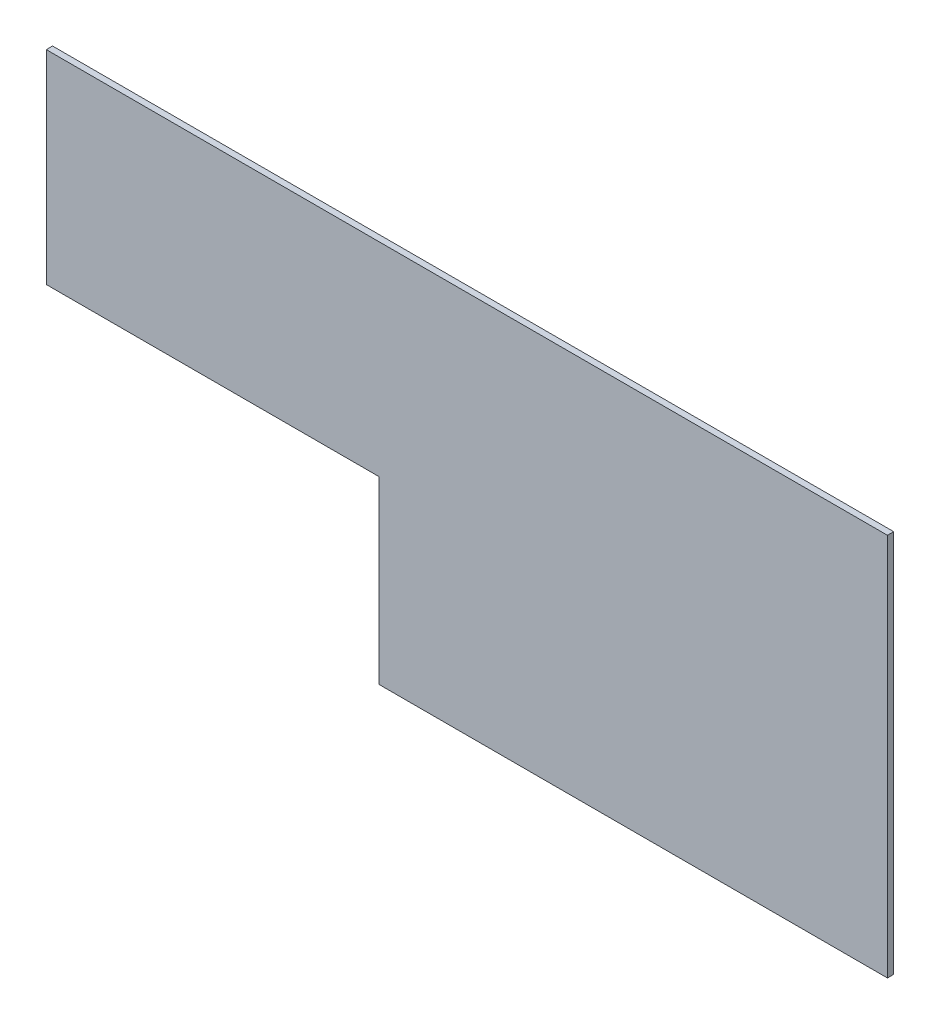
ISO-10303-21;
HEADER;
FILE_DESCRIPTION(('STEP AP214'),'2;1');
FILE_NAME('part.step','',(''),(''),'','','');
FILE_SCHEMA(('AUTOMOTIVE_DESIGN { 1 0 10303 214 1 1 1 1 }'));
ENDSEC;
DATA;
#1=APPLICATION_CONTEXT('core data for automotive mechanical design processes');
#2=APPLICATION_PROTOCOL_DEFINITION('international standard','automotive_design',2000,#1);
#3=PRODUCT_CONTEXT('',#1,'mechanical');
#4=PRODUCT('Part','Part','',(#3));
#5=PRODUCT_RELATED_PRODUCT_CATEGORY('part','',(#4));
#6=PRODUCT_DEFINITION_FORMATION('','',#4);
#7=PRODUCT_DEFINITION_CONTEXT('part definition',#1,'design');
#8=PRODUCT_DEFINITION('design','',#6,#7);
#9=PRODUCT_DEFINITION_SHAPE('','',#8);
#10=(LENGTH_UNIT() NAMED_UNIT(*) SI_UNIT(.MILLI.,.METRE.));
#11=(NAMED_UNIT(*) PLANE_ANGLE_UNIT() SI_UNIT($,.RADIAN.));
#12=(NAMED_UNIT(*) SI_UNIT($,.STERADIAN.) SOLID_ANGLE_UNIT());
#13=UNCERTAINTY_MEASURE_WITH_UNIT(LENGTH_MEASURE(1.E-05),#10,'distance_accuracy_value','');
#14=(GEOMETRIC_REPRESENTATION_CONTEXT(3) GLOBAL_UNCERTAINTY_ASSIGNED_CONTEXT((#13)) GLOBAL_UNIT_ASSIGNED_CONTEXT((#10,
#11,#12)) REPRESENTATION_CONTEXT('',''));
#15=CARTESIAN_POINT('',(0.,0.,0.));
#16=DIRECTION('',(0.,0.,1.));
#17=DIRECTION('',(1.,0.,0.));
#18=AXIS2_PLACEMENT_3D('',#15,#16,#17);
#19=CARTESIAN_POINT('',(4.39438672274884,99.7694438554211,1.6));
#20=DIRECTION('',(1.,0.,0.));
#21=DIRECTION('',(0.,1.,0.));
#22=AXIS2_PLACEMENT_3D('',#19,#20,#21);
#23=PLANE('',#22);
#24=DIRECTION('',(0.,-1.,0.));
#25=VECTOR('',#24,1.);
#26=CARTESIAN_POINT('',(4.39438672274884,99.7694438554211,0.));
#27=LINE('',#26,#25);
#28=CARTESIAN_POINT('',(4.39438672274884,99.7694438554211,0.));
#29=VERTEX_POINT('',#28);
#30=CARTESIAN_POINT('',(4.39438672274881,47.7694438554211,0.));
#31=VERTEX_POINT('',#30);
#32=EDGE_CURVE('E117',#29,#31,#27,.T.);
#33=ORIENTED_EDGE('',*,*,#32,.T.);
#34=DIRECTION('',(0.,0.,-1.));
#35=VECTOR('',#34,1.);
#36=CARTESIAN_POINT('',(4.39438672274881,47.7694438554211,1.6));
#37=LINE('',#36,#35);
#38=CARTESIAN_POINT('',(4.39438672274881,47.7694438554211,1.6));
#39=VERTEX_POINT('',#38);
#40=EDGE_CURVE('E11',#39,#31,#37,.T.);
#41=ORIENTED_EDGE('',*,*,#40,.F.);
#42=DIRECTION('',(0.,-1.,0.));
#43=VECTOR('',#42,1.);
#44=CARTESIAN_POINT('',(4.39438672274884,99.7694438554211,1.6));
#45=LINE('',#44,#43);
#46=CARTESIAN_POINT('',(4.39438672274884,99.7694438554211,1.6));
#47=VERTEX_POINT('',#46);
#48=EDGE_CURVE('E127',#47,#39,#45,.T.);
#49=ORIENTED_EDGE('',*,*,#48,.F.);
#50=DIRECTION('',(0.,0.,-1.));
#51=VECTOR('',#50,1.);
#52=CARTESIAN_POINT('',(4.39438672274884,99.7694438554211,1.6));
#53=LINE('',#52,#51);
#54=EDGE_CURVE('E113',#47,#29,#53,.T.);
#55=ORIENTED_EDGE('',*,*,#54,.T.);
#56=EDGE_LOOP('',(#33,#41,#49,#55));
#57=FACE_BOUND('',#56,.T.);
#58=ADVANCED_FACE('F33',(#57),#23,.F.);
#59=CARTESIAN_POINT('',(4.39438672274881,47.7694438554211,1.6));
#60=DIRECTION('',(0.,1.,0.));
#61=DIRECTION('',(0.,0.,1.));
#62=AXIS2_PLACEMENT_3D('',#59,#60,#61);
#63=PLANE('',#62);
#64=DIRECTION('',(1.,0.,0.));
#65=VECTOR('',#64,1.);
#66=CARTESIAN_POINT('',(4.39438672274881,47.7694438554211,0.));
#67=LINE('',#66,#65);
#68=CARTESIAN_POINT('',(89.3943867227489,47.7694438554211,0.));
#69=VERTEX_POINT('',#68);
#70=EDGE_CURVE('E120',#31,#69,#67,.T.);
#71=ORIENTED_EDGE('',*,*,#70,.T.);
#72=DIRECTION('',(0.,0.,-1.));
#73=VECTOR('',#72,1.);
#74=CARTESIAN_POINT('',(89.3943867227489,47.7694438554211,1.6));
#75=LINE('',#74,#73);
#76=CARTESIAN_POINT('',(89.3943867227489,47.7694438554211,1.6));
#77=VERTEX_POINT('',#76);
#78=EDGE_CURVE('E41',#77,#69,#75,.T.);
#79=ORIENTED_EDGE('',*,*,#78,.F.);
#80=DIRECTION('',(1.,0.,0.));
#81=VECTOR('',#80,1.);
#82=CARTESIAN_POINT('',(4.39438672274881,47.7694438554211,1.6));
#83=LINE('',#82,#81);
#84=EDGE_CURVE('E86',#39,#77,#83,.T.);
#85=ORIENTED_EDGE('',*,*,#84,.F.);
#86=ORIENTED_EDGE('',*,*,#40,.T.);
#87=EDGE_LOOP('',(#71,#79,#85,#86));
#88=FACE_BOUND('',#87,.T.);
#89=ADVANCED_FACE('F151',(#88),#63,.F.);
#90=CARTESIAN_POINT('',(89.3943867227489,47.7694438554211,1.6));
#91=DIRECTION('',(1.,0.,0.));
#92=DIRECTION('',(0.,1.,0.));
#93=AXIS2_PLACEMENT_3D('',#90,#91,#92);
#94=PLANE('',#93);
#95=DIRECTION('',(0.,-1.,0.));
#96=VECTOR('',#95,1.);
#97=CARTESIAN_POINT('',(89.3943867227489,47.7694438554211,0.));
#98=LINE('',#97,#96);
#99=CARTESIAN_POINT('',(89.3943867227489,1.76944385542113,0.));
#100=VERTEX_POINT('',#99);
#101=EDGE_CURVE('E122',#69,#100,#98,.T.);
#102=ORIENTED_EDGE('',*,*,#101,.T.);
#103=DIRECTION('',(0.,0.,-1.));
#104=VECTOR('',#103,1.);
#105=CARTESIAN_POINT('',(89.3943867227489,1.76944385542113,1.6));
#106=LINE('',#105,#104);
#107=CARTESIAN_POINT('',(89.3943867227489,1.76944385542113,1.6));
#108=VERTEX_POINT('',#107);
#109=EDGE_CURVE('E108',#108,#100,#106,.T.);
#110=ORIENTED_EDGE('',*,*,#109,.F.);
#111=DIRECTION('',(0.,-1.,0.));
#112=VECTOR('',#111,1.);
#113=CARTESIAN_POINT('',(89.3943867227489,47.7694438554211,1.6));
#114=LINE('',#113,#112);
#115=EDGE_CURVE('E99',#77,#108,#114,.T.);
#116=ORIENTED_EDGE('',*,*,#115,.F.);
#117=ORIENTED_EDGE('',*,*,#78,.T.);
#118=EDGE_LOOP('',(#102,#110,#116,#117));
#119=FACE_BOUND('',#118,.T.);
#120=ADVANCED_FACE('F133',(#119),#94,.F.);
#121=CARTESIAN_POINT('',(89.3943867227489,1.76944385542113,1.6));
#122=DIRECTION('',(0.,1.,0.));
#123=DIRECTION('',(0.,0.,1.));
#124=AXIS2_PLACEMENT_3D('',#121,#122,#123);
#125=PLANE('',#124);
#126=DIRECTION('',(1.,0.,0.));
#127=VECTOR('',#126,1.);
#128=CARTESIAN_POINT('',(89.3943867227489,1.76944385542113,0.));
#129=LINE('',#128,#127);
#130=CARTESIAN_POINT('',(219.394386722749,1.76944385542113,0.));
#131=VERTEX_POINT('',#130);
#132=EDGE_CURVE('E107',#100,#131,#129,.T.);
#133=ORIENTED_EDGE('',*,*,#132,.T.);
#134=DIRECTION('',(0.,0.,-1.));
#135=VECTOR('',#134,1.);
#136=CARTESIAN_POINT('',(219.394386722749,1.76944385542113,1.6));
#137=LINE('',#136,#135);
#138=CARTESIAN_POINT('',(219.394386722749,1.76944385542113,1.6));
#139=VERTEX_POINT('',#138);
#140=EDGE_CURVE('E104',#139,#131,#137,.T.);
#141=ORIENTED_EDGE('',*,*,#140,.F.);
#142=DIRECTION('',(1.,0.,0.));
#143=VECTOR('',#142,1.);
#144=CARTESIAN_POINT('',(89.3943867227489,1.76944385542113,1.6));
#145=LINE('',#144,#143);
#146=EDGE_CURVE('E93',#108,#139,#145,.T.);
#147=ORIENTED_EDGE('',*,*,#146,.F.);
#148=ORIENTED_EDGE('',*,*,#109,.T.);
#149=EDGE_LOOP('',(#133,#141,#147,#148));
#150=FACE_BOUND('',#149,.T.);
#151=ADVANCED_FACE('F105',(#150),#125,.F.);
#152=CARTESIAN_POINT('',(219.394386722749,1.76944385542113,1.6));
#153=DIRECTION('',(-1.,0.,0.));
#154=DIRECTION('',(0.,-1.,0.));
#155=AXIS2_PLACEMENT_3D('',#152,#153,#154);
#156=PLANE('',#155);
#157=DIRECTION('',(0.,1.,0.));
#158=VECTOR('',#157,1.);
#159=CARTESIAN_POINT('',(219.394386722749,1.76944385542113,0.));
#160=LINE('',#159,#158);
#161=CARTESIAN_POINT('',(219.394386722749,99.7694438554211,0.));
#162=VERTEX_POINT('',#161);
#163=EDGE_CURVE('E72',#131,#162,#160,.T.);
#164=ORIENTED_EDGE('',*,*,#163,.T.);
#165=DIRECTION('',(0.,0.,-1.));
#166=VECTOR('',#165,1.);
#167=CARTESIAN_POINT('',(219.394386722749,99.7694438554211,1.6));
#168=LINE('',#167,#166);
#169=CARTESIAN_POINT('',(219.394386722749,99.7694438554211,1.6));
#170=VERTEX_POINT('',#169);
#171=EDGE_CURVE('E109',#170,#162,#168,.T.);
#172=ORIENTED_EDGE('',*,*,#171,.F.);
#173=DIRECTION('',(0.,1.,0.));
#174=VECTOR('',#173,1.);
#175=CARTESIAN_POINT('',(219.394386722749,1.76944385542113,1.6));
#176=LINE('',#175,#174);
#177=EDGE_CURVE('E97',#139,#170,#176,.T.);
#178=ORIENTED_EDGE('',*,*,#177,.F.);
#179=ORIENTED_EDGE('',*,*,#140,.T.);
#180=EDGE_LOOP('',(#164,#172,#178,#179));
#181=FACE_BOUND('',#180,.T.);
#182=ADVANCED_FACE('F111',(#181),#156,.F.);
#183=CARTESIAN_POINT('',(219.394386722749,99.7694438554211,1.6));
#184=DIRECTION('',(0.,-1.,0.));
#185=DIRECTION('',(0.,0.,-1.));
#186=AXIS2_PLACEMENT_3D('',#183,#184,#185);
#187=PLANE('',#186);
#188=DIRECTION('',(-1.,0.,0.));
#189=VECTOR('',#188,1.);
#190=CARTESIAN_POINT('',(219.394386722749,99.7694438554211,0.));
#191=LINE('',#190,#189);
#192=EDGE_CURVE('E78',#162,#29,#191,.T.);
#193=ORIENTED_EDGE('',*,*,#192,.T.);
#194=ORIENTED_EDGE('',*,*,#54,.F.);
#195=DIRECTION('',(-1.,0.,0.));
#196=VECTOR('',#195,1.);
#197=CARTESIAN_POINT('',(219.394386722749,99.7694438554211,1.6));
#198=LINE('',#197,#196);
#199=EDGE_CURVE('E49',#170,#47,#198,.T.);
#200=ORIENTED_EDGE('',*,*,#199,.F.);
#201=ORIENTED_EDGE('',*,*,#171,.T.);
#202=EDGE_LOOP('',(#193,#194,#200,#201));
#203=FACE_BOUND('',#202,.T.);
#204=ADVANCED_FACE('F140',(#203),#187,.F.);
#205=CARTESIAN_POINT('',(0.,0.,1.6));
#206=DIRECTION('',(0.,0.,1.));
#207=DIRECTION('',(1.,0.,0.));
#208=AXIS2_PLACEMENT_3D('',#205,#206,#207);
#209=PLANE('',#208);
#210=ORIENTED_EDGE('',*,*,#48,.T.);
#211=ORIENTED_EDGE('',*,*,#84,.T.);
#212=ORIENTED_EDGE('',*,*,#115,.T.);
#213=ORIENTED_EDGE('',*,*,#146,.T.);
#214=ORIENTED_EDGE('',*,*,#177,.T.);
#215=ORIENTED_EDGE('',*,*,#199,.T.);
#216=EDGE_LOOP('',(#210,#211,#212,#213,#214,#215));
#217=FACE_BOUND('',#216,.T.);
#218=ADVANCED_FACE('F95',(#217),#209,.T.);
#219=CARTESIAN_POINT('',(0.,0.,0.));
#220=DIRECTION('',(0.,0.,1.));
#221=DIRECTION('',(1.,0.,0.));
#222=AXIS2_PLACEMENT_3D('',#219,#220,#221);
#223=PLANE('',#222);
#224=ORIENTED_EDGE('',*,*,#32,.F.);
#225=ORIENTED_EDGE('',*,*,#192,.F.);
#226=ORIENTED_EDGE('',*,*,#163,.F.);
#227=ORIENTED_EDGE('',*,*,#132,.F.);
#228=ORIENTED_EDGE('',*,*,#101,.F.);
#229=ORIENTED_EDGE('',*,*,#70,.F.);
#230=EDGE_LOOP('',(#224,#225,#226,#227,#228,#229));
#231=FACE_BOUND('',#230,.T.);
#232=ADVANCED_FACE('F136',(#231),#223,.F.);
#233=CLOSED_SHELL('',(#58,#89,#120,#151,#182,#204,#218,#232));
#234=MANIFOLD_SOLID_BREP('B2',#233);
#235=ADVANCED_BREP_SHAPE_REPRESENTATION('',(#18,#234),#14);
#236=SHAPE_DEFINITION_REPRESENTATION(#9,#235);
ENDSEC;
END-ISO-10303-21;
